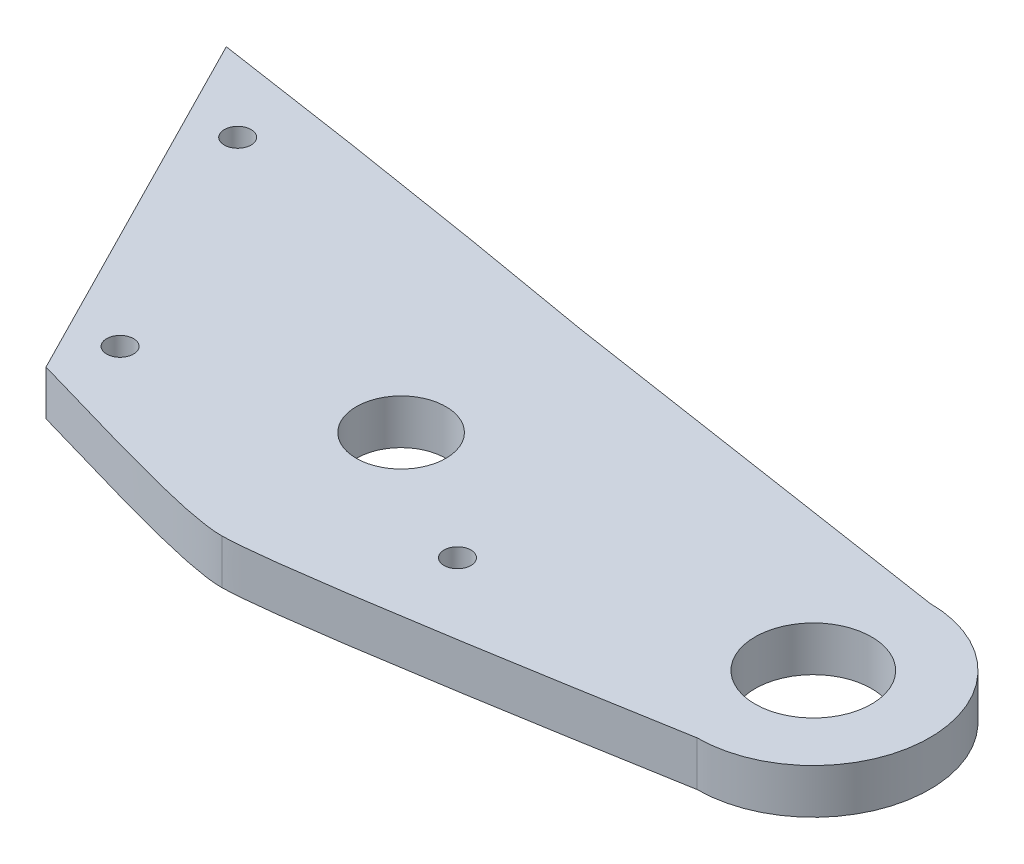
ISO-10303-21;
HEADER;
FILE_DESCRIPTION(('STEP AP214'),'2;1');
FILE_NAME('part.step','',(''),(''),'','','');
FILE_SCHEMA(('AUTOMOTIVE_DESIGN { 1 0 10303 214 1 1 1 1 }'));
ENDSEC;
DATA;
#1=APPLICATION_CONTEXT('core data for automotive mechanical design processes');
#2=APPLICATION_PROTOCOL_DEFINITION('international standard','automotive_design',2000,#1);
#3=PRODUCT_CONTEXT('',#1,'mechanical');
#4=PRODUCT('Part','Part','',(#3));
#5=PRODUCT_RELATED_PRODUCT_CATEGORY('part','',(#4));
#6=PRODUCT_DEFINITION_FORMATION('','',#4);
#7=PRODUCT_DEFINITION_CONTEXT('part definition',#1,'design');
#8=PRODUCT_DEFINITION('design','',#6,#7);
#9=PRODUCT_DEFINITION_SHAPE('','',#8);
#10=(LENGTH_UNIT() NAMED_UNIT(*) SI_UNIT(.MILLI.,.METRE.));
#11=(NAMED_UNIT(*) PLANE_ANGLE_UNIT() SI_UNIT($,.RADIAN.));
#12=(NAMED_UNIT(*) SI_UNIT($,.STERADIAN.) SOLID_ANGLE_UNIT());
#13=UNCERTAINTY_MEASURE_WITH_UNIT(LENGTH_MEASURE(1.E-05),#10,'distance_accuracy_value','');
#14=(GEOMETRIC_REPRESENTATION_CONTEXT(3) GLOBAL_UNCERTAINTY_ASSIGNED_CONTEXT((#13)) GLOBAL_UNIT_ASSIGNED_CONTEXT((#10,
#11,#12)) REPRESENTATION_CONTEXT('',''));
#15=CARTESIAN_POINT('',(0.,0.,0.));
#16=DIRECTION('',(0.,0.,1.));
#17=DIRECTION('',(1.,0.,0.));
#18=AXIS2_PLACEMENT_3D('',#15,#16,#17);
#19=CARTESIAN_POINT('',(0.,-20.,-20.));
#20=CARTESIAN_POINT('',(0.0315030304128688,-20.,-20.));
#21=CARTESIAN_POINT('',(46.0000000000001,-20.,-13.));
#22=B_SPLINE_CURVE_WITH_KNOTS('',2,(#19,#20,#21),.UNSPECIFIED.,.F.,.F.,(3,3),(0.,1.),.UNSPECIFIED.);
#23=DIRECTION('',(0.,1.,0.));
#24=VECTOR('',#23,1.);
#25=SURFACE_OF_LINEAR_EXTRUSION('',#22,#24);
#26=CARTESIAN_POINT('',(0.,-15.,-20.));
#27=CARTESIAN_POINT('',(0.0315030304128688,-15.,-20.));
#28=CARTESIAN_POINT('',(46.0000000000001,-15.,-13.));
#29=B_SPLINE_CURVE_WITH_KNOTS('',2,(#26,#27,#28),.UNSPECIFIED.,.F.,.F.,(3,3),(0.,1.),.UNSPECIFIED.);
#30=CARTESIAN_POINT('',(46.0000000000001,-15.,-13.));
#31=VERTEX_POINT('',#30);
#32=CARTESIAN_POINT('',(0.,-15.,-20.));
#33=VERTEX_POINT('',#32);
#34=EDGE_CURVE('E195',#31,#33,#29,.F.);
#35=ORIENTED_EDGE('',*,*,#34,.F.);
#36=DIRECTION('',(0.,1.,0.));
#37=VECTOR('',#36,1.);
#38=CARTESIAN_POINT('',(46.0000000000001,-20.,-13.));
#39=LINE('',#38,#37);
#40=CARTESIAN_POINT('',(46.0000000000001,-20.,-13.));
#41=VERTEX_POINT('',#40);
#42=EDGE_CURVE('E47',#41,#31,#39,.T.);
#43=ORIENTED_EDGE('',*,*,#42,.F.);
#44=CARTESIAN_POINT('',(3.0608351006138E-13,-20.,-20.));
#45=VERTEX_POINT('',#44);
#46=EDGE_CURVE('E59',#45,#41,#22,.T.);
#47=ORIENTED_EDGE('',*,*,#46,.F.);
#48=DIRECTION('',(0.,1.,0.));
#49=VECTOR('',#48,1.);
#50=CARTESIAN_POINT('',(3.0608351006138E-13,-20.,-20.));
#51=LINE('',#50,#49);
#52=EDGE_CURVE('E11',#45,#33,#51,.T.);
#53=ORIENTED_EDGE('',*,*,#52,.T.);
#54=EDGE_LOOP('',(#35,#43,#47,#53));
#55=FACE_BOUND('',#54,.T.);
#56=ADVANCED_FACE('F35',(#55),#25,.F.);
#57=CARTESIAN_POINT('',(46.,-20.,0.));
#58=DIRECTION('',(0.,1.,0.));
#59=DIRECTION('',(0.,0.,1.));
#60=AXIS2_PLACEMENT_3D('',#57,#58,#59);
#61=CYLINDRICAL_SURFACE('',#60,13.);
#62=ORIENTED_EDGE('',*,*,#42,.T.);
#63=CARTESIAN_POINT('',(46.,-15.,0.));
#64=DIRECTION('',(0.,1.,0.));
#65=DIRECTION('',(0.,0.,1.));
#66=AXIS2_PLACEMENT_3D('',#63,#64,#65);
#67=CIRCLE('',#66,13.);
#68=CARTESIAN_POINT('',(46.0000000000001,-15.,13.));
#69=VERTEX_POINT('',#68);
#70=EDGE_CURVE('E198',#31,#69,#67,.F.);
#71=ORIENTED_EDGE('',*,*,#70,.T.);
#72=DIRECTION('',(0.,1.,0.));
#73=VECTOR('',#72,1.);
#74=CARTESIAN_POINT('',(46.,-20.,13.));
#75=LINE('',#74,#73);
#76=CARTESIAN_POINT('',(46.,-20.,13.));
#77=VERTEX_POINT('',#76);
#78=EDGE_CURVE('E164',#77,#69,#75,.T.);
#79=ORIENTED_EDGE('',*,*,#78,.F.);
#80=CARTESIAN_POINT('',(46.,-20.,0.));
#81=DIRECTION('',(0.,1.,0.));
#82=DIRECTION('',(0.,0.,1.));
#83=AXIS2_PLACEMENT_3D('',#80,#81,#82);
#84=CIRCLE('',#83,13.);
#85=EDGE_CURVE('E115',#77,#41,#84,.T.);
#86=ORIENTED_EDGE('',*,*,#85,.T.);
#87=EDGE_LOOP('',(#62,#71,#79,#86));
#88=FACE_BOUND('',#87,.T.);
#89=ADVANCED_FACE('F138',(#88),#61,.T.);
#90=CARTESIAN_POINT('',(0.,-20.,20.));
#91=CARTESIAN_POINT('',(5.90849770251433,-20.,20.));
#92=CARTESIAN_POINT('',(46.0000000000001,-20.,13.));
#93=B_SPLINE_CURVE_WITH_KNOTS('',2,(#90,#91,#92),.UNSPECIFIED.,.F.,.F.,(3,3),(0.,1.),.UNSPECIFIED.);
#94=DIRECTION('',(0.,1.,0.));
#95=VECTOR('',#94,1.);
#96=SURFACE_OF_LINEAR_EXTRUSION('',#93,#95);
#97=ORIENTED_EDGE('',*,*,#78,.T.);
#98=CARTESIAN_POINT('',(0.,-15.,20.));
#99=CARTESIAN_POINT('',(5.90849770251433,-15.,20.));
#100=CARTESIAN_POINT('',(46.0000000000001,-15.,13.));
#101=B_SPLINE_CURVE_WITH_KNOTS('',2,(#98,#99,#100),.UNSPECIFIED.,.F.,.F.,(3,3),(0.,1.),.UNSPECIFIED.);
#102=CARTESIAN_POINT('',(0.,-15.,20.));
#103=VERTEX_POINT('',#102);
#104=EDGE_CURVE('E187',#69,#103,#101,.F.);
#105=ORIENTED_EDGE('',*,*,#104,.T.);
#106=DIRECTION('',(0.,1.,0.));
#107=VECTOR('',#106,1.);
#108=CARTESIAN_POINT('',(0.,-20.,20.));
#109=LINE('',#108,#107);
#110=CARTESIAN_POINT('',(0.,-20.,20.));
#111=VERTEX_POINT('',#110);
#112=EDGE_CURVE('E160',#111,#103,#109,.T.);
#113=ORIENTED_EDGE('',*,*,#112,.F.);
#114=EDGE_CURVE('E113',#111,#77,#93,.T.);
#115=ORIENTED_EDGE('',*,*,#114,.T.);
#116=EDGE_LOOP('',(#97,#105,#113,#115));
#117=FACE_BOUND('',#116,.T.);
#118=ADVANCED_FACE('F134',(#117),#96,.T.);
#119=CARTESIAN_POINT('',(0.,-20.,0.));
#120=DIRECTION('',(0.,1.,0.));
#121=DIRECTION('',(0.,0.,1.));
#122=AXIS2_PLACEMENT_3D('',#119,#120,#121);
#123=CYLINDRICAL_SURFACE('',#122,5.);
#124=CARTESIAN_POINT('',(0.,-20.,0.));
#125=DIRECTION('',(0.,1.,0.));
#126=DIRECTION('',(0.,0.,1.));
#127=AXIS2_PLACEMENT_3D('',#124,#125,#126);
#128=CIRCLE('',#127,5.);
#129=CARTESIAN_POINT('',(0.,-20.,5.));
#130=VERTEX_POINT('',#129);
#131=EDGE_CURVE('E152',#130,#130,#128,.T.);
#132=ORIENTED_EDGE('',*,*,#131,.F.);
#133=EDGE_LOOP('',(#132));
#134=FACE_BOUND('',#133,.T.);
#135=CARTESIAN_POINT('',(0.,-15.,0.));
#136=DIRECTION('',(0.,1.,0.));
#137=DIRECTION('',(0.,0.,1.));
#138=AXIS2_PLACEMENT_3D('',#135,#136,#137);
#139=CIRCLE('',#138,5.);
#140=CARTESIAN_POINT('',(0.,-15.,5.));
#141=VERTEX_POINT('',#140);
#142=EDGE_CURVE('E171',#141,#141,#139,.F.);
#143=ORIENTED_EDGE('',*,*,#142,.F.);
#144=EDGE_LOOP('',(#143));
#145=FACE_BOUND('',#144,.T.);
#146=ADVANCED_FACE('F137',(#134,#145),#123,.F.);
#147=CARTESIAN_POINT('',(46.,-20.,0.));
#148=DIRECTION('',(0.,1.,0.));
#149=DIRECTION('',(0.,0.,1.));
#150=AXIS2_PLACEMENT_3D('',#147,#148,#149);
#151=CYLINDRICAL_SURFACE('',#150,6.5);
#152=CARTESIAN_POINT('',(46.,-20.,0.));
#153=DIRECTION('',(0.,1.,0.));
#154=DIRECTION('',(0.,0.,1.));
#155=AXIS2_PLACEMENT_3D('',#152,#153,#154);
#156=CIRCLE('',#155,6.5);
#157=CARTESIAN_POINT('',(46.,-20.,6.5));
#158=VERTEX_POINT('',#157);
#159=EDGE_CURVE('E158',#158,#158,#156,.T.);
#160=ORIENTED_EDGE('',*,*,#159,.F.);
#161=EDGE_LOOP('',(#160));
#162=FACE_BOUND('',#161,.T.);
#163=CARTESIAN_POINT('',(46.,-15.,0.));
#164=DIRECTION('',(0.,1.,0.));
#165=DIRECTION('',(0.,0.,1.));
#166=AXIS2_PLACEMENT_3D('',#163,#164,#165);
#167=CIRCLE('',#166,6.5);
#168=CARTESIAN_POINT('',(46.,-15.,6.5));
#169=VERTEX_POINT('',#168);
#170=EDGE_CURVE('E168',#169,#169,#167,.F.);
#171=ORIENTED_EDGE('',*,*,#170,.F.);
#172=EDGE_LOOP('',(#171));
#173=FACE_BOUND('',#172,.T.);
#174=ADVANCED_FACE('F248',(#162,#173),#151,.F.);
#175=CARTESIAN_POINT('',(-328.284271247462,-20.,-28.284271247462));
#176=CARTESIAN_POINT('',(-300.,-20.,-56.5685424949237));
#177=CARTESIAN_POINT('',(-114.87313182139,-20.,-40.3782898364083));
#178=CARTESIAN_POINT('',(3.06083510061379E-13,-20.,-19.9999999999999));
#179=B_SPLINE_CURVE_WITH_KNOTS('',3,(#175,#176,#177,#178),.UNSPECIFIED.,.F.,.F.,(4,4),(0.,1.),.UNSPECIFIED.);
#180=DIRECTION('',(0.,1.,0.));
#181=VECTOR('',#180,1.);
#182=SURFACE_OF_LINEAR_EXTRUSION('',#179,#181);
#183=CARTESIAN_POINT('',(-47.0370499959522,-20.,-27.5275485228644));
#184=VERTEX_POINT('',#183);
#185=EDGE_CURVE('E55',#184,#45,#179,.T.);
#186=ORIENTED_EDGE('',*,*,#185,.F.);
#187=DIRECTION('',(0.,1.,0.));
#188=VECTOR('',#187,1.);
#189=CARTESIAN_POINT('',(-47.0370499959522,-30.,-27.5275485228644));
#190=LINE('',#189,#188);
#191=CARTESIAN_POINT('',(-47.0370499959522,-15.,-27.5275485228644));
#192=VERTEX_POINT('',#191);
#193=EDGE_CURVE('E97',#184,#192,#190,.T.);
#194=ORIENTED_EDGE('',*,*,#193,.T.);
#195=CARTESIAN_POINT('',(-328.284271247462,-15.,-28.284271247462));
#196=CARTESIAN_POINT('',(-300.,-15.,-56.5685424949237));
#197=CARTESIAN_POINT('',(-114.87313182139,-15.,-40.3782898364083));
#198=CARTESIAN_POINT('',(3.06083510061379E-13,-15.,-19.9999999999999));
#199=B_SPLINE_CURVE_WITH_KNOTS('',3,(#195,#196,#197,#198),.UNSPECIFIED.,.F.,.F.,(4,4),(0.,1.),.UNSPECIFIED.);
#200=EDGE_CURVE('E117',#33,#192,#199,.F.);
#201=ORIENTED_EDGE('',*,*,#200,.F.);
#202=ORIENTED_EDGE('',*,*,#52,.F.);
#203=EDGE_LOOP('',(#186,#194,#201,#202));
#204=FACE_BOUND('',#203,.T.);
#205=ADVANCED_FACE('F37',(#204),#182,.F.);
#206=CARTESIAN_POINT('',(-271.715728752538,-20.,28.2842712474621));
#207=CARTESIAN_POINT('',(-189.219937614107,-20.,-54.211519890968));
#208=CARTESIAN_POINT('',(-19.999999999993,-20.,20.0000000000001));
#209=CARTESIAN_POINT('',(0.,-20.,20.));
#210=B_SPLINE_CURVE_WITH_KNOTS('',3,(#206,#207,#208,#209),.UNSPECIFIED.,.F.,.F.,(4,4),(0.,1.),.UNSPECIFIED.);
#211=DIRECTION('',(0.,1.,0.));
#212=VECTOR('',#211,1.);
#213=SURFACE_OF_LINEAR_EXTRUSION('',#210,#212);
#214=DIRECTION('',(0.,1.,0.));
#215=VECTOR('',#214,1.);
#216=CARTESIAN_POINT('',(-26.1376583175019,-30.,13.489817143929));
#217=LINE('',#216,#215);
#218=CARTESIAN_POINT('',(-26.1376583175019,-20.,13.489817143929));
#219=VERTEX_POINT('',#218);
#220=CARTESIAN_POINT('',(-26.1376583175021,-15.,13.4898171439286));
#221=VERTEX_POINT('',#220);
#222=EDGE_CURVE('E94',#219,#221,#217,.T.);
#223=ORIENTED_EDGE('',*,*,#222,.F.);
#224=EDGE_CURVE('E105',#219,#111,#210,.T.);
#225=ORIENTED_EDGE('',*,*,#224,.T.);
#226=ORIENTED_EDGE('',*,*,#112,.T.);
#227=CARTESIAN_POINT('',(-271.715728752538,-15.,28.2842712474621));
#228=CARTESIAN_POINT('',(-189.219937614107,-15.,-54.211519890968));
#229=CARTESIAN_POINT('',(-19.999999999993,-15.,20.0000000000001));
#230=CARTESIAN_POINT('',(0.,-15.,20.));
#231=B_SPLINE_CURVE_WITH_KNOTS('',3,(#227,#228,#229,#230),.UNSPECIFIED.,.F.,.F.,(4,4),(0.,1.),.UNSPECIFIED.);
#232=EDGE_CURVE('E107',#103,#221,#231,.F.);
#233=ORIENTED_EDGE('',*,*,#232,.T.);
#234=EDGE_LOOP('',(#223,#225,#226,#233));
#235=FACE_BOUND('',#234,.T.);
#236=ADVANCED_FACE('F103',(#235),#213,.T.);
#237=CARTESIAN_POINT('',(0.,-20.,0.));
#238=DIRECTION('',(0.,1.,0.));
#239=DIRECTION('',(0.,0.,1.));
#240=AXIS2_PLACEMENT_3D('',#237,#238,#239);
#241=PLANE('',#240);
#242=CARTESIAN_POINT('',(-37.6430801624777,-20.,-19.4089952906017));
#243=DIRECTION('',(0.,-1.,0.));
#244=DIRECTION('',(0.,0.,-1.));
#245=AXIS2_PLACEMENT_3D('',#242,#243,#244);
#246=CIRCLE('',#245,1.5);
#247=CARTESIAN_POINT('',(-37.6430801624777,-20.,-20.9089952906017));
#248=VERTEX_POINT('',#247);
#249=EDGE_CURVE('E99',#248,#248,#246,.T.);
#250=ORIENTED_EDGE('',*,*,#249,.F.);
#251=EDGE_LOOP('',(#250));
#252=FACE_BOUND('',#251,.T.);
#253=CARTESIAN_POINT('',(15.2511081020538,-20.,8.960330165173));
#254=DIRECTION('',(0.,-1.,0.));
#255=DIRECTION('',(0.,0.,-1.));
#256=AXIS2_PLACEMENT_3D('',#253,#254,#255);
#257=CIRCLE('',#256,1.5);
#258=CARTESIAN_POINT('',(15.2511081020538,-20.,7.460330165173));
#259=VERTEX_POINT('',#258);
#260=EDGE_CURVE('E219',#259,#259,#257,.T.);
#261=ORIENTED_EDGE('',*,*,#260,.F.);
#262=EDGE_LOOP('',(#261));
#263=FACE_BOUND('',#262,.T.);
#264=CARTESIAN_POINT('',(-24.0051606068246,-20.,7.35692890255748));
#265=DIRECTION('',(0.,-1.,0.));
#266=DIRECTION('',(0.,0.,-1.));
#267=AXIS2_PLACEMENT_3D('',#264,#265,#266);
#268=CIRCLE('',#267,1.5);
#269=CARTESIAN_POINT('',(-24.0051606068246,-20.,5.85692890255748));
#270=VERTEX_POINT('',#269);
#271=EDGE_CURVE('E177',#270,#270,#268,.T.);
#272=ORIENTED_EDGE('',*,*,#271,.F.);
#273=EDGE_LOOP('',(#272));
#274=FACE_BOUND('',#273,.T.);
#275=ORIENTED_EDGE('',*,*,#224,.F.);
#276=DIRECTION('',(-0.453990499739548,0.,-0.891006524188367));
#277=VECTOR('',#276,1.);
#278=CARTESIAN_POINT('',(-26.2072398632191,-20.,13.3532556713151));
#279=LINE('',#278,#277);
#280=EDGE_CURVE('E91',#219,#184,#279,.T.);
#281=ORIENTED_EDGE('',*,*,#280,.T.);
#282=ORIENTED_EDGE('',*,*,#185,.T.);
#283=ORIENTED_EDGE('',*,*,#46,.T.);
#284=ORIENTED_EDGE('',*,*,#85,.F.);
#285=ORIENTED_EDGE('',*,*,#114,.F.);
#286=EDGE_LOOP('',(#275,#281,#282,#283,#284,#285));
#287=FACE_BOUND('',#286,.T.);
#288=ORIENTED_EDGE('',*,*,#131,.T.);
#289=EDGE_LOOP('',(#288));
#290=FACE_BOUND('',#289,.T.);
#291=ORIENTED_EDGE('',*,*,#159,.T.);
#292=EDGE_LOOP('',(#291));
#293=FACE_BOUND('',#292,.T.);
#294=ADVANCED_FACE('F110',(#252,#263,#274,#287,#290,#293),#241,.F.);
#295=CARTESIAN_POINT('',(0.,-15.,0.));
#296=DIRECTION('',(0.,1.,0.));
#297=DIRECTION('',(0.,0.,1.));
#298=AXIS2_PLACEMENT_3D('',#295,#296,#297);
#299=PLANE('',#298);
#300=CARTESIAN_POINT('',(-37.6430801624777,-15.,-19.4089952906017));
#301=DIRECTION('',(0.,1.,0.));
#302=DIRECTION('',(0.,0.,1.));
#303=AXIS2_PLACEMENT_3D('',#300,#301,#302);
#304=CIRCLE('',#303,1.5);
#305=CARTESIAN_POINT('',(-37.6430801624777,-15.,-17.9089952906017));
#306=VERTEX_POINT('',#305);
#307=EDGE_CURVE('E180',#306,#306,#304,.T.);
#308=ORIENTED_EDGE('',*,*,#307,.F.);
#309=EDGE_LOOP('',(#308));
#310=FACE_BOUND('',#309,.T.);
#311=CARTESIAN_POINT('',(15.2511081020538,-15.,8.960330165173));
#312=DIRECTION('',(0.,1.,0.));
#313=DIRECTION('',(0.,0.,1.));
#314=AXIS2_PLACEMENT_3D('',#311,#312,#313);
#315=CIRCLE('',#314,1.5);
#316=CARTESIAN_POINT('',(15.2511081020538,-15.,10.460330165173));
#317=VERTEX_POINT('',#316);
#318=EDGE_CURVE('E176',#317,#317,#315,.T.);
#319=ORIENTED_EDGE('',*,*,#318,.F.);
#320=EDGE_LOOP('',(#319));
#321=FACE_BOUND('',#320,.T.);
#322=CARTESIAN_POINT('',(-24.0051606068246,-15.,7.35692890255748));
#323=DIRECTION('',(0.,1.,0.));
#324=DIRECTION('',(0.,0.,1.));
#325=AXIS2_PLACEMENT_3D('',#322,#323,#324);
#326=CIRCLE('',#325,1.5);
#327=CARTESIAN_POINT('',(-24.0051606068246,-15.,8.85692890255748));
#328=VERTEX_POINT('',#327);
#329=EDGE_CURVE('E173',#328,#328,#326,.T.);
#330=ORIENTED_EDGE('',*,*,#329,.F.);
#331=EDGE_LOOP('',(#330));
#332=FACE_BOUND('',#331,.T.);
#333=ORIENTED_EDGE('',*,*,#142,.T.);
#334=EDGE_LOOP('',(#333));
#335=FACE_BOUND('',#334,.T.);
#336=ORIENTED_EDGE('',*,*,#170,.T.);
#337=EDGE_LOOP('',(#336));
#338=FACE_BOUND('',#337,.T.);
#339=ORIENTED_EDGE('',*,*,#200,.T.);
#340=DIRECTION('',(0.453990499739548,0.,0.891006524188367));
#341=VECTOR('',#340,1.);
#342=CARTESIAN_POINT('',(-17.2627680221852,-15.,30.9077700727233));
#343=LINE('',#342,#341);
#344=EDGE_CURVE('E172',#192,#221,#343,.T.);
#345=ORIENTED_EDGE('',*,*,#344,.T.);
#346=ORIENTED_EDGE('',*,*,#232,.F.);
#347=ORIENTED_EDGE('',*,*,#104,.F.);
#348=ORIENTED_EDGE('',*,*,#70,.F.);
#349=ORIENTED_EDGE('',*,*,#34,.T.);
#350=EDGE_LOOP('',(#339,#345,#346,#347,#348,#349));
#351=FACE_BOUND('',#350,.T.);
#352=ADVANCED_FACE('F231',(#310,#321,#332,#335,#338,#351),#299,.T.);
#353=CARTESIAN_POINT('',(-24.0051606068246,-10.,7.35692890255748));
#354=DIRECTION('',(0.,-1.,0.));
#355=DIRECTION('',(0.,0.,-1.));
#356=AXIS2_PLACEMENT_3D('',#353,#354,#355);
#357=CYLINDRICAL_SURFACE('',#356,1.5);
#358=ORIENTED_EDGE('',*,*,#329,.T.);
#359=EDGE_LOOP('',(#358));
#360=FACE_BOUND('',#359,.T.);
#361=ORIENTED_EDGE('',*,*,#271,.T.);
#362=EDGE_LOOP('',(#361));
#363=FACE_BOUND('',#362,.T.);
#364=ADVANCED_FACE('F233',(#360,#363),#357,.F.);
#365=CARTESIAN_POINT('',(15.2511081020538,-10.,8.960330165173));
#366=DIRECTION('',(0.,-1.,0.));
#367=DIRECTION('',(0.,0.,-1.));
#368=AXIS2_PLACEMENT_3D('',#365,#366,#367);
#369=CYLINDRICAL_SURFACE('',#368,1.5);
#370=ORIENTED_EDGE('',*,*,#318,.T.);
#371=EDGE_LOOP('',(#370));
#372=FACE_BOUND('',#371,.T.);
#373=ORIENTED_EDGE('',*,*,#260,.T.);
#374=EDGE_LOOP('',(#373));
#375=FACE_BOUND('',#374,.T.);
#376=ADVANCED_FACE('F240',(#372,#375),#369,.F.);
#377=CARTESIAN_POINT('',(-37.6430801624777,-10.,-19.4089952906017));
#378=DIRECTION('',(0.,-1.,0.));
#379=DIRECTION('',(0.,0.,-1.));
#380=AXIS2_PLACEMENT_3D('',#377,#378,#379);
#381=CYLINDRICAL_SURFACE('',#380,1.5);
#382=ORIENTED_EDGE('',*,*,#307,.T.);
#383=EDGE_LOOP('',(#382));
#384=FACE_BOUND('',#383,.T.);
#385=ORIENTED_EDGE('',*,*,#249,.T.);
#386=EDGE_LOOP('',(#385));
#387=FACE_BOUND('',#386,.T.);
#388=ADVANCED_FACE('F302',(#384,#387),#381,.F.);
#389=CARTESIAN_POINT('',(-47.0370499959522,-30.,-27.5275485228644));
#390=DIRECTION('',(0.891006524188367,0.,-0.453990499739548));
#391=DIRECTION('',(-0.453990499739548,0.,-0.891006524188367));
#392=AXIS2_PLACEMENT_3D('',#389,#390,#391);
#393=PLANE('',#392);
#394=ORIENTED_EDGE('',*,*,#222,.T.);
#395=ORIENTED_EDGE('',*,*,#344,.F.);
#396=ORIENTED_EDGE('',*,*,#193,.F.);
#397=ORIENTED_EDGE('',*,*,#280,.F.);
#398=EDGE_LOOP('',(#394,#395,#396,#397));
#399=FACE_BOUND('',#398,.T.);
#400=ADVANCED_FACE('F93',(#399),#393,.F.);
#401=CLOSED_SHELL('',(#56,#89,#118,#146,#174,#205,#236,#294,#352,#364,#376,#388,#400));
#402=MANIFOLD_SOLID_BREP('B2',#401);
#403=ADVANCED_BREP_SHAPE_REPRESENTATION('',(#18,#402),#14);
#404=SHAPE_DEFINITION_REPRESENTATION(#9,#403);
ENDSEC;
END-ISO-10303-21;
